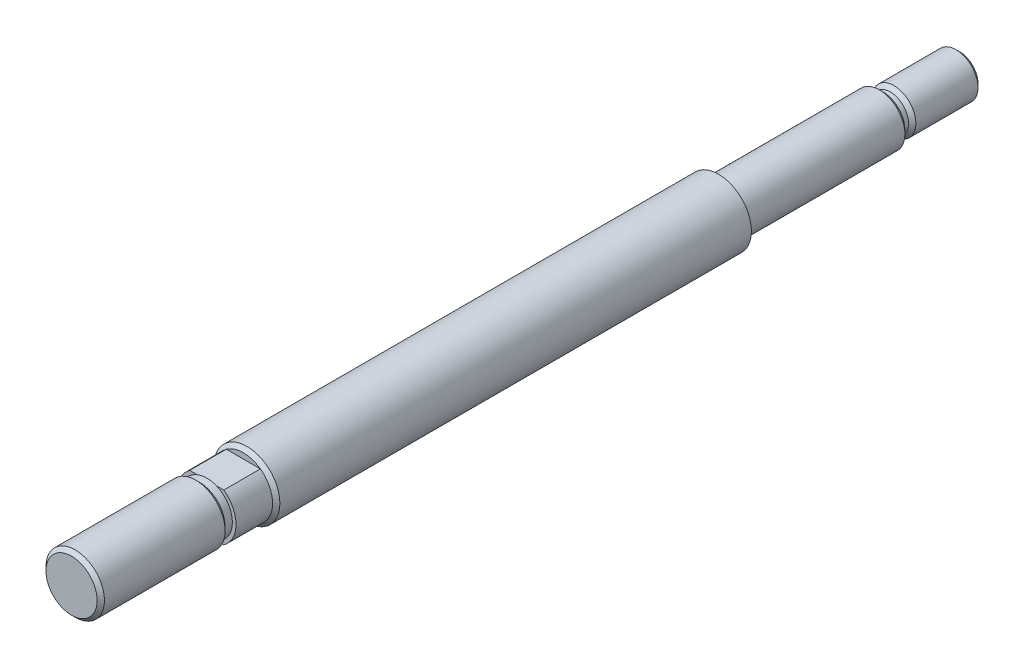
ISO-10303-21;
HEADER;
FILE_DESCRIPTION(('STEP AP214'),'2;1');
FILE_NAME('part.step','',(''),(''),'','','');
FILE_SCHEMA(('AUTOMOTIVE_DESIGN { 1 0 10303 214 1 1 1 1 }'));
ENDSEC;
DATA;
#1=APPLICATION_CONTEXT('core data for automotive mechanical design processes');
#2=APPLICATION_PROTOCOL_DEFINITION('international standard','automotive_design',2000,#1);
#3=PRODUCT_CONTEXT('',#1,'mechanical');
#4=PRODUCT('Part','Part','',(#3));
#5=PRODUCT_RELATED_PRODUCT_CATEGORY('part','',(#4));
#6=PRODUCT_DEFINITION_FORMATION('','',#4);
#7=PRODUCT_DEFINITION_CONTEXT('part definition',#1,'design');
#8=PRODUCT_DEFINITION('design','',#6,#7);
#9=PRODUCT_DEFINITION_SHAPE('','',#8);
#10=(LENGTH_UNIT() NAMED_UNIT(*) SI_UNIT(.MILLI.,.METRE.));
#11=(NAMED_UNIT(*) PLANE_ANGLE_UNIT() SI_UNIT($,.RADIAN.));
#12=(NAMED_UNIT(*) SI_UNIT($,.STERADIAN.) SOLID_ANGLE_UNIT());
#13=UNCERTAINTY_MEASURE_WITH_UNIT(LENGTH_MEASURE(1.E-05),#10,'distance_accuracy_value','');
#14=(GEOMETRIC_REPRESENTATION_CONTEXT(3) GLOBAL_UNCERTAINTY_ASSIGNED_CONTEXT((#13)) GLOBAL_UNIT_ASSIGNED_CONTEXT((#10,
#11,#12)) REPRESENTATION_CONTEXT('',''));
#15=CARTESIAN_POINT('',(0.,0.,0.));
#16=DIRECTION('',(0.,0.,1.));
#17=DIRECTION('',(1.,0.,0.));
#18=AXIS2_PLACEMENT_3D('',#15,#16,#17);
#19=CARTESIAN_POINT('',(0.,0.,84.5));
#20=DIRECTION('',(0.,0.,1.));
#21=DIRECTION('',(1.,0.,0.));
#22=AXIS2_PLACEMENT_3D('',#19,#20,#21);
#23=PLANE('',#22);
#24=DIRECTION('',(1.,0.,0.));
#25=VECTOR('',#24,1.);
#26=CARTESIAN_POINT('',(-17.5,-6.5,84.5));
#27=LINE('',#26,#25);
#28=CARTESIAN_POINT('',(2.59807621135341,-6.5,84.4999999999914));
#29=VERTEX_POINT('',#28);
#30=CARTESIAN_POINT('',(4.66368952654441,-6.5,84.5));
#31=VERTEX_POINT('',#30);
#32=EDGE_CURVE('E107',#29,#31,#27,.T.);
#33=ORIENTED_EDGE('',*,*,#32,.T.);
#34=CARTESIAN_POINT('',(0.,0.,84.5));
#35=DIRECTION('',(0.,0.,1.));
#36=DIRECTION('',(1.,0.,0.));
#37=AXIS2_PLACEMENT_3D('',#34,#35,#36);
#38=CIRCLE('',#37,8.);
#39=CARTESIAN_POINT('',(4.66368952654441,6.5,84.5));
#40=VERTEX_POINT('',#39);
#41=EDGE_CURVE('E125',#31,#40,#38,.T.);
#42=ORIENTED_EDGE('',*,*,#41,.T.);
#43=DIRECTION('',(1.,0.,0.));
#44=VECTOR('',#43,1.);
#45=CARTESIAN_POINT('',(-17.5,6.5,84.5));
#46=LINE('',#45,#44);
#47=CARTESIAN_POINT('',(2.59807621135341,6.5,84.4999999999914));
#48=VERTEX_POINT('',#47);
#49=EDGE_CURVE('E265',#48,#40,#46,.T.);
#50=ORIENTED_EDGE('',*,*,#49,.F.);
#51=CARTESIAN_POINT('',(0.,0.,84.4999999999914));
#52=DIRECTION('',(0.,0.,1.));
#53=DIRECTION('',(1.,0.,0.));
#54=AXIS2_PLACEMENT_3D('',#51,#52,#53);
#55=CIRCLE('',#54,7.00000000000003);
#56=EDGE_CURVE('E259',#29,#48,#55,.T.);
#57=ORIENTED_EDGE('',*,*,#56,.F.);
#58=EDGE_LOOP('',(#33,#42,#50,#57));
#59=FACE_BOUND('',#58,.T.);
#60=ADVANCED_FACE('F44',(#59),#23,.T.);
#61=CARTESIAN_POINT('',(0.,0.,84.5));
#62=DIRECTION('',(0.,0.,-1.));
#63=DIRECTION('',(-1.,0.,0.));
#64=AXIS2_PLACEMENT_3D('',#61,#62,#63);
#65=CYLINDRICAL_SURFACE('',#64,8.);
#66=CARTESIAN_POINT('',(0.,0.,74.5));
#67=DIRECTION('',(0.,0.,1.));
#68=DIRECTION('',(1.,0.,0.));
#69=AXIS2_PLACEMENT_3D('',#66,#67,#68);
#70=CIRCLE('',#69,8.);
#71=CARTESIAN_POINT('',(-4.66368952654447,6.5,74.5));
#72=VERTEX_POINT('',#71);
#73=CARTESIAN_POINT('',(-4.66368952654447,-6.5,74.5));
#74=VERTEX_POINT('',#73);
#75=EDGE_CURVE('E120',#72,#74,#70,.T.);
#76=ORIENTED_EDGE('',*,*,#75,.T.);
#77=DIRECTION('',(0.,0.,-1.));
#78=VECTOR('',#77,1.);
#79=CARTESIAN_POINT('',(-4.66368952654441,-6.5,84.5));
#80=LINE('',#79,#78);
#81=CARTESIAN_POINT('',(-4.66368952654441,-6.5,84.5));
#82=VERTEX_POINT('',#81);
#83=EDGE_CURVE('E105',#74,#82,#80,.F.);
#84=ORIENTED_EDGE('',*,*,#83,.T.);
#85=CARTESIAN_POINT('',(-4.66368952654441,6.5,84.5));
#86=VERTEX_POINT('',#85);
#87=EDGE_CURVE('E114',#86,#82,#38,.T.);
#88=ORIENTED_EDGE('',*,*,#87,.F.);
#89=DIRECTION('',(0.,0.,-1.));
#90=VECTOR('',#89,1.);
#91=CARTESIAN_POINT('',(-4.66368952654441,6.5,84.5));
#92=LINE('',#91,#90);
#93=EDGE_CURVE('E254',#86,#72,#92,.T.);
#94=ORIENTED_EDGE('',*,*,#93,.T.);
#95=EDGE_LOOP('',(#76,#84,#88,#94));
#96=FACE_BOUND('',#95,.T.);
#97=ADVANCED_FACE('F113',(#96),#65,.T.);
#98=CARTESIAN_POINT('',(-2.59807621135341,-6.5,84.4999999999914));
#99=VERTEX_POINT('',#98);
#100=EDGE_CURVE('E96',#82,#99,#27,.T.);
#101=ORIENTED_EDGE('',*,*,#100,.T.);
#102=CARTESIAN_POINT('',(-2.59807621135341,6.5,84.4999999999914));
#103=VERTEX_POINT('',#102);
#104=EDGE_CURVE('E274',#103,#99,#55,.T.);
#105=ORIENTED_EDGE('',*,*,#104,.F.);
#106=EDGE_CURVE('E70',#86,#103,#46,.T.);
#107=ORIENTED_EDGE('',*,*,#106,.F.);
#108=ORIENTED_EDGE('',*,*,#87,.T.);
#109=EDGE_LOOP('',(#101,#105,#107,#108));
#110=FACE_BOUND('',#109,.T.);
#111=ADVANCED_FACE('F119',(#110),#23,.T.);
#112=CARTESIAN_POINT('',(0.,0.,121.5));
#113=DIRECTION('',(0.,0.,-1.));
#114=DIRECTION('',(-1.,0.,0.));
#115=AXIS2_PLACEMENT_3D('',#112,#113,#114);
#116=CYLINDRICAL_SURFACE('',#115,9.);
#117=CARTESIAN_POINT('',(0.,0.,73.5));
#118=DIRECTION('',(0.,0.,1.));
#119=DIRECTION('',(1.,0.,0.));
#120=AXIS2_PLACEMENT_3D('',#117,#118,#119);
#121=CIRCLE('',#120,9.);
#122=CARTESIAN_POINT('',(9.,0.,73.5));
#123=VERTEX_POINT('',#122);
#124=EDGE_CURVE('E160',#123,#123,#121,.F.);
#125=ORIENTED_EDGE('',*,*,#124,.T.);
#126=EDGE_LOOP('',(#125));
#127=FACE_BOUND('',#126,.T.);
#128=CARTESIAN_POINT('',(0.,0.,-55.5));
#129=DIRECTION('',(0.,0.,-1.));
#130=DIRECTION('',(-1.,0.,0.));
#131=AXIS2_PLACEMENT_3D('',#128,#129,#130);
#132=CIRCLE('',#131,9.);
#133=CARTESIAN_POINT('',(-9.,0.,-55.5));
#134=VERTEX_POINT('',#133);
#135=EDGE_CURVE('E123',#134,#134,#132,.T.);
#136=ORIENTED_EDGE('',*,*,#135,.F.);
#137=EDGE_LOOP('',(#136));
#138=FACE_BOUND('',#137,.T.);
#139=ADVANCED_FACE('F210',(#127,#138),#116,.T.);
#140=CARTESIAN_POINT('',(0.,0.,-100.5));
#141=DIRECTION('',(0.,0.,-1.));
#142=DIRECTION('',(-1.,0.,0.));
#143=AXIS2_PLACEMENT_3D('',#140,#141,#142);
#144=PLANE('',#143);
#145=CARTESIAN_POINT('',(0.,0.,-100.5));
#146=DIRECTION('',(0.,0.,-1.));
#147=DIRECTION('',(-1.,0.,0.));
#148=AXIS2_PLACEMENT_3D('',#145,#146,#147);
#149=CIRCLE('',#148,6.00000000000012);
#150=CARTESIAN_POINT('',(-6.00000000000012,0.,-100.5));
#151=VERTEX_POINT('',#150);
#152=EDGE_CURVE('E139',#151,#151,#149,.T.);
#153=ORIENTED_EDGE('',*,*,#152,.T.);
#154=EDGE_LOOP('',(#153));
#155=FACE_BOUND('',#154,.T.);
#156=CARTESIAN_POINT('',(0.,0.,-100.5));
#157=DIRECTION('',(0.,0.,-1.));
#158=DIRECTION('',(-1.,0.,0.));
#159=AXIS2_PLACEMENT_3D('',#156,#157,#158);
#160=CIRCLE('',#159,5.);
#161=CARTESIAN_POINT('',(-5.,0.,-100.5));
#162=VERTEX_POINT('',#161);
#163=EDGE_CURVE('E134',#162,#162,#160,.T.);
#164=ORIENTED_EDGE('',*,*,#163,.F.);
#165=EDGE_LOOP('',(#164));
#166=FACE_BOUND('',#165,.T.);
#167=ADVANCED_FACE('F212',(#155,#166),#144,.T.);
#168=CARTESIAN_POINT('',(0.,0.,-100.5));
#169=DIRECTION('',(0.,0.,-1.));
#170=DIRECTION('',(-1.,0.,0.));
#171=AXIS2_PLACEMENT_3D('',#168,#169,#170);
#172=CYLINDRICAL_SURFACE('',#171,5.);
#173=ORIENTED_EDGE('',*,*,#163,.T.);
#174=EDGE_LOOP('',(#173));
#175=FACE_BOUND('',#174,.T.);
#176=CARTESIAN_POINT('',(0.,0.,-102.5));
#177=DIRECTION('',(0.,0.,-1.));
#178=DIRECTION('',(-1.,0.,0.));
#179=AXIS2_PLACEMENT_3D('',#176,#177,#178);
#180=CIRCLE('',#179,5.);
#181=CARTESIAN_POINT('',(-5.,0.,-102.5));
#182=VERTEX_POINT('',#181);
#183=EDGE_CURVE('E137',#182,#182,#180,.T.);
#184=ORIENTED_EDGE('',*,*,#183,.F.);
#185=EDGE_LOOP('',(#184));
#186=FACE_BOUND('',#185,.T.);
#187=ADVANCED_FACE('F220',(#175,#186),#172,.T.);
#188=CARTESIAN_POINT('',(0.,0.,-121.5));
#189=DIRECTION('',(0.,0.,1.));
#190=DIRECTION('',(1.,0.,0.));
#191=AXIS2_PLACEMENT_3D('',#188,#189,#190);
#192=PLANE('',#191);
#193=CARTESIAN_POINT('',(0.,0.,-121.5));
#194=DIRECTION('',(0.,0.,1.));
#195=DIRECTION('',(1.,0.,0.));
#196=AXIS2_PLACEMENT_3D('',#193,#194,#195);
#197=CIRCLE('',#196,5.);
#198=CARTESIAN_POINT('',(5.,0.,-121.5));
#199=VERTEX_POINT('',#198);
#200=EDGE_CURVE('E154',#199,#199,#197,.F.);
#201=ORIENTED_EDGE('',*,*,#200,.T.);
#202=EDGE_LOOP('',(#201));
#203=FACE_BOUND('',#202,.T.);
#204=ADVANCED_FACE('F225',(#203),#192,.F.);
#205=CARTESIAN_POINT('',(0.,0.,-102.5));
#206=DIRECTION('',(0.,0.,-1.));
#207=DIRECTION('',(-1.,0.,0.));
#208=AXIS2_PLACEMENT_3D('',#205,#206,#207);
#209=CYLINDRICAL_SURFACE('',#208,6.);
#210=CARTESIAN_POINT('',(0.,0.,-103.5));
#211=DIRECTION('',(0.,0.,-1.));
#212=DIRECTION('',(-1.,0.,0.));
#213=AXIS2_PLACEMENT_3D('',#210,#211,#212);
#214=CIRCLE('',#213,6.);
#215=CARTESIAN_POINT('',(-6.,0.,-103.5));
#216=VERTEX_POINT('',#215);
#217=EDGE_CURVE('E153',#216,#216,#214,.T.);
#218=ORIENTED_EDGE('',*,*,#217,.T.);
#219=EDGE_LOOP('',(#218));
#220=FACE_BOUND('',#219,.T.);
#221=CARTESIAN_POINT('',(0.,0.,-120.5));
#222=DIRECTION('',(0.,0.,1.));
#223=DIRECTION('',(1.,0.,0.));
#224=AXIS2_PLACEMENT_3D('',#221,#222,#223);
#225=CIRCLE('',#224,6.);
#226=CARTESIAN_POINT('',(6.,0.,-120.5));
#227=VERTEX_POINT('',#226);
#228=EDGE_CURVE('E149',#227,#227,#225,.T.);
#229=ORIENTED_EDGE('',*,*,#228,.T.);
#230=EDGE_LOOP('',(#229));
#231=FACE_BOUND('',#230,.T.);
#232=ADVANCED_FACE('F343',(#220,#231),#209,.T.);
#233=CARTESIAN_POINT('',(0.,0.,-55.5));
#234=DIRECTION('',(0.,0.,-1.));
#235=DIRECTION('',(-1.,0.,0.));
#236=AXIS2_PLACEMENT_3D('',#233,#234,#235);
#237=PLANE('',#236);
#238=CARTESIAN_POINT('',(0.,0.,-55.5));
#239=DIRECTION('',(0.,0.,-1.));
#240=DIRECTION('',(-1.,0.,0.));
#241=AXIS2_PLACEMENT_3D('',#238,#239,#240);
#242=CIRCLE('',#241,7.);
#243=CARTESIAN_POINT('',(-7.,0.,-55.5));
#244=VERTEX_POINT('',#243);
#245=EDGE_CURVE('E122',#244,#244,#242,.T.);
#246=ORIENTED_EDGE('',*,*,#245,.F.);
#247=EDGE_LOOP('',(#246));
#248=FACE_BOUND('',#247,.T.);
#249=ORIENTED_EDGE('',*,*,#135,.T.);
#250=EDGE_LOOP('',(#249));
#251=FACE_BOUND('',#250,.T.);
#252=ADVANCED_FACE('F349',(#248,#251),#237,.T.);
#253=CARTESIAN_POINT('',(0.,0.,-55.5));
#254=DIRECTION('',(0.,0.,-1.));
#255=DIRECTION('',(-1.,0.,0.));
#256=AXIS2_PLACEMENT_3D('',#253,#254,#255);
#257=CYLINDRICAL_SURFACE('',#256,7.);
#258=CARTESIAN_POINT('',(0.,0.,-99.5000000000001));
#259=DIRECTION('',(0.,0.,-1.));
#260=DIRECTION('',(-1.,0.,0.));
#261=AXIS2_PLACEMENT_3D('',#258,#259,#260);
#262=CIRCLE('',#261,7.);
#263=CARTESIAN_POINT('',(-7.,0.,-99.5000000000001));
#264=VERTEX_POINT('',#263);
#265=EDGE_CURVE('E143',#264,#264,#262,.F.);
#266=CARTESIAN_POINT('',(-7.,0.,-99.5000000000001));
#267=CARTESIAN_POINT('',(-7.,0.,-99.0416666666668));
#268=CARTESIAN_POINT('',(-7.,0.,-98.5833333333334));
#269=CARTESIAN_POINT('',(-7.,0.,-97.6666666666668));
#270=CARTESIAN_POINT('',(-7.,0.,-97.2083333333334));
#271=CARTESIAN_POINT('',(-7.,0.,-96.2916666666667));
#272=CARTESIAN_POINT('',(-7.,0.,-95.8333333333334));
#273=CARTESIAN_POINT('',(-7.,0.,-94.9166666666667));
#274=CARTESIAN_POINT('',(-7.,0.,-94.4583333333334));
#275=CARTESIAN_POINT('',(-7.,0.,-93.5416666666667));
#276=CARTESIAN_POINT('',(-7.,0.,-93.0833333333334));
#277=CARTESIAN_POINT('',(-7.,0.,-92.1666666666667));
#278=CARTESIAN_POINT('',(-7.,0.,-91.7083333333334));
#279=CARTESIAN_POINT('',(-7.,0.,-90.7916666666667));
#280=CARTESIAN_POINT('',(-7.,0.,-90.3333333333334));
#281=CARTESIAN_POINT('',(-7.,0.,-89.4166666666667));
#282=CARTESIAN_POINT('',(-7.,0.,-88.9583333333334));
#283=CARTESIAN_POINT('',(-7.,0.,-88.0416666666667));
#284=CARTESIAN_POINT('',(-7.,0.,-87.5833333333334));
#285=CARTESIAN_POINT('',(-7.,0.,-86.6666666666667));
#286=CARTESIAN_POINT('',(-7.,0.,-86.2083333333334));
#287=CARTESIAN_POINT('',(-7.,0.,-85.2916666666667));
#288=CARTESIAN_POINT('',(-7.,0.,-84.8333333333334));
#289=CARTESIAN_POINT('',(-7.,0.,-83.9166666666667));
#290=CARTESIAN_POINT('',(-7.,0.,-83.4583333333334));
#291=CARTESIAN_POINT('',(-7.,0.,-82.5416666666667));
#292=CARTESIAN_POINT('',(-7.,0.,-82.0833333333334));
#293=CARTESIAN_POINT('',(-7.,0.,-81.1666666666667));
#294=CARTESIAN_POINT('',(-7.,0.,-80.7083333333334));
#295=CARTESIAN_POINT('',(-7.,0.,-79.7916666666667));
#296=CARTESIAN_POINT('',(-7.,0.,-79.3333333333334));
#297=CARTESIAN_POINT('',(-7.,0.,-78.4166666666667));
#298=CARTESIAN_POINT('',(-7.,0.,-77.9583333333334));
#299=CARTESIAN_POINT('',(-7.,0.,-77.0416666666667));
#300=CARTESIAN_POINT('',(-7.,0.,-76.5833333333334));
#301=CARTESIAN_POINT('',(-7.,0.,-75.6666666666667));
#302=CARTESIAN_POINT('',(-7.,0.,-75.2083333333334));
#303=CARTESIAN_POINT('',(-7.,0.,-74.2916666666667));
#304=CARTESIAN_POINT('',(-7.,0.,-73.8333333333334));
#305=CARTESIAN_POINT('',(-7.,0.,-72.9166666666667));
#306=CARTESIAN_POINT('',(-7.,0.,-72.4583333333334));
#307=CARTESIAN_POINT('',(-7.,0.,-71.5416666666667));
#308=CARTESIAN_POINT('',(-7.,0.,-71.0833333333334));
#309=CARTESIAN_POINT('',(-7.,0.,-70.1666666666667));
#310=CARTESIAN_POINT('',(-7.,0.,-69.7083333333334));
#311=CARTESIAN_POINT('',(-7.,0.,-68.7916666666667));
#312=CARTESIAN_POINT('',(-7.,0.,-68.3333333333334));
#313=CARTESIAN_POINT('',(-7.,0.,-67.4166666666667));
#314=CARTESIAN_POINT('',(-7.,0.,-66.9583333333334));
#315=CARTESIAN_POINT('',(-7.,0.,-66.0416666666667));
#316=CARTESIAN_POINT('',(-7.,0.,-65.5833333333333));
#317=CARTESIAN_POINT('',(-7.,0.,-64.6666666666667));
#318=CARTESIAN_POINT('',(-7.,0.,-64.2083333333333));
#319=CARTESIAN_POINT('',(-7.,0.,-63.2916666666667));
#320=CARTESIAN_POINT('',(-7.,0.,-62.8333333333333));
#321=CARTESIAN_POINT('',(-7.,0.,-61.9166666666667));
#322=CARTESIAN_POINT('',(-7.,0.,-61.4583333333333));
#323=CARTESIAN_POINT('',(-7.,0.,-60.5416666666667));
#324=CARTESIAN_POINT('',(-7.,0.,-60.0833333333333));
#325=CARTESIAN_POINT('',(-7.,0.,-59.1666666666667));
#326=CARTESIAN_POINT('',(-7.,0.,-58.7083333333333));
#327=CARTESIAN_POINT('',(-7.,0.,-57.7916666666667));
#328=CARTESIAN_POINT('',(-7.,0.,-57.3333333333333));
#329=CARTESIAN_POINT('',(-7.,0.,-56.4166666666667));
#330=CARTESIAN_POINT('',(-7.,0.,-55.9583333333333));
#331=CARTESIAN_POINT('',(-7.,0.,-55.5));
#332=B_SPLINE_CURVE_WITH_KNOTS('',3,(#266,#267,#268,#269,#270,#271,#272,#273,#274,#275,#276,
#277,#278,#279,#280,#281,#282,#283,#284,#285,#286,#287,#288,#289,#290,#291,#292,#293,#294,#295,
#296,#297,#298,#299,#300,#301,#302,#303,#304,#305,#306,#307,#308,#309,#310,#311,#312,#313,#314,
#315,#316,#317,#318,#319,#320,#321,#322,#323,#324,#325,#326,#327,#328,#329,#330,#331),
.UNSPECIFIED.,.F.,.F.,(4,2,2,2,2,2,2,2,2,2,2,2,2,2,2,2,2,2,2,2,2,2,2,2,2,2,2,2,2,2,2,2,4),(0.,
1.37499999999999,2.75,4.125,5.50000000000001,6.87500000000002,8.25000000000001,9.62500000000002,
11.,12.375,13.75,15.125,16.5,17.875,19.25,20.625,22.,23.375,24.75,26.1250000000001,
27.5000000000001,28.8750000000001,30.2500000000001,31.6250000000001,33.0000000000001,
34.3750000000001,35.7500000000001,37.1250000000001,38.5000000000001,39.8750000000001,
41.2500000000001,42.6250000000001,44.0000000000001),.UNSPECIFIED.);
#333=EDGE_CURVE('BSEAM227',#264,#244,#332,.T.);
#334=ORIENTED_EDGE('',*,*,#265,.T.);
#335=ORIENTED_EDGE('',*,*,#245,.T.);
#336=ORIENTED_EDGE('',*,*,#333,.T.);
#337=ORIENTED_EDGE('',*,*,#333,.F.);
#338=EDGE_LOOP('',(#334,#336,#335,#337));
#339=FACE_BOUND('',#338,.T.);
#340=ADVANCED_FACE('F227',(#339),#257,.T.);
#341=CARTESIAN_POINT('',(0.,0.,-100.5));
#342=DIRECTION('',(0.,0.,1.));
#343=DIRECTION('',(1.,0.,0.));
#344=AXIS2_PLACEMENT_3D('',#341,#342,#343);
#345=CONICAL_SURFACE('',#344,6.00000000000012,0.785398163397446);
#346=ORIENTED_EDGE('',*,*,#265,.F.);
#347=EDGE_LOOP('',(#346));
#348=FACE_BOUND('',#347,.T.);
#349=ORIENTED_EDGE('',*,*,#152,.F.);
#350=EDGE_LOOP('',(#349));
#351=FACE_BOUND('',#350,.T.);
#352=ADVANCED_FACE('F222',(#348,#351),#345,.T.);
#353=CARTESIAN_POINT('',(0.,0.,-102.5));
#354=DIRECTION('',(0.,0.,-1.));
#355=DIRECTION('',(-1.,0.,0.));
#356=AXIS2_PLACEMENT_3D('',#353,#354,#355);
#357=CONICAL_SURFACE('',#356,5.,0.785398163397439);
#358=ORIENTED_EDGE('',*,*,#217,.F.);
#359=EDGE_LOOP('',(#358));
#360=FACE_BOUND('',#359,.T.);
#361=ORIENTED_EDGE('',*,*,#183,.T.);
#362=EDGE_LOOP('',(#361));
#363=FACE_BOUND('',#362,.T.);
#364=ADVANCED_FACE('F228',(#360,#363),#357,.T.);
#365=CARTESIAN_POINT('',(0.,0.,-121.5));
#366=DIRECTION('',(0.,0.,1.));
#367=DIRECTION('',(1.,0.,0.));
#368=AXIS2_PLACEMENT_3D('',#365,#366,#367);
#369=CONICAL_SURFACE('',#368,5.,0.785398163397439);
#370=ORIENTED_EDGE('',*,*,#228,.F.);
#371=EDGE_LOOP('',(#370));
#372=FACE_BOUND('',#371,.T.);
#373=ORIENTED_EDGE('',*,*,#200,.F.);
#374=EDGE_LOOP('',(#373));
#375=FACE_BOUND('',#374,.T.);
#376=ADVANCED_FACE('F233',(#372,#375),#369,.T.);
#377=ORIENTED_EDGE('',*,*,#41,.F.);
#378=DIRECTION('',(0.,0.,-1.));
#379=VECTOR('',#378,1.);
#380=CARTESIAN_POINT('',(4.66368952654441,-6.5,84.5));
#381=LINE('',#380,#379);
#382=CARTESIAN_POINT('',(4.66368952654447,-6.5,74.5));
#383=VERTEX_POINT('',#382);
#384=EDGE_CURVE('E117',#31,#383,#381,.T.);
#385=ORIENTED_EDGE('',*,*,#384,.T.);
#386=CARTESIAN_POINT('',(4.66368952654447,6.5,74.5));
#387=VERTEX_POINT('',#386);
#388=EDGE_CURVE('E135',#383,#387,#70,.T.);
#389=ORIENTED_EDGE('',*,*,#388,.T.);
#390=DIRECTION('',(0.,0.,-1.));
#391=VECTOR('',#390,1.);
#392=CARTESIAN_POINT('',(4.66368952654441,6.5,84.5));
#393=LINE('',#392,#391);
#394=EDGE_CURVE('E257',#387,#40,#393,.F.);
#395=ORIENTED_EDGE('',*,*,#394,.T.);
#396=EDGE_LOOP('',(#377,#385,#389,#395));
#397=FACE_BOUND('',#396,.T.);
#398=ADVANCED_FACE('F205',(#397),#65,.T.);
#399=CARTESIAN_POINT('',(0.,0.,74.5));
#400=DIRECTION('',(0.,0.,-1.));
#401=DIRECTION('',(-1.,0.,0.));
#402=AXIS2_PLACEMENT_3D('',#399,#400,#401);
#403=CONICAL_SURFACE('',#402,8.00000000000004,0.785398163397436);
#404=ORIENTED_EDGE('',*,*,#124,.F.);
#405=EDGE_LOOP('',(#404));
#406=FACE_BOUND('',#405,.T.);
#407=EDGE_CURVE('E130',#387,#72,#70,.T.);
#408=ORIENTED_EDGE('',*,*,#407,.F.);
#409=ORIENTED_EDGE('',*,*,#388,.F.);
#410=EDGE_CURVE('E275',#74,#383,#70,.T.);
#411=ORIENTED_EDGE('',*,*,#410,.F.);
#412=ORIENTED_EDGE('',*,*,#75,.F.);
#413=EDGE_LOOP('',(#408,#409,#411,#412));
#414=FACE_BOUND('',#413,.T.);
#415=ADVANCED_FACE('F195',(#406,#414),#403,.T.);
#416=CARTESIAN_POINT('',(0.,0.,-500000.));
#417=DIRECTION('',(0.,0.,1.));
#418=DIRECTION('',(1.,0.,0.));
#419=AXIS2_PLACEMENT_3D('',#416,#417,#418);
#420=CYLINDRICAL_SURFACE('',#419,7.00000000000003);
#421=EDGE_CURVE('E128',#48,#103,#55,.T.);
#422=ORIENTED_EDGE('',*,*,#421,.T.);
#423=ORIENTED_EDGE('',*,*,#104,.T.);
#424=EDGE_CURVE('E256',#99,#29,#55,.T.);
#425=ORIENTED_EDGE('',*,*,#424,.T.);
#426=ORIENTED_EDGE('',*,*,#56,.T.);
#427=EDGE_LOOP('',(#422,#423,#425,#426));
#428=FACE_BOUND('',#427,.T.);
#429=CARTESIAN_POINT('',(0.,0.,86.5));
#430=DIRECTION('',(0.,0.,1.));
#431=DIRECTION('',(1.,0.,0.));
#432=AXIS2_PLACEMENT_3D('',#429,#430,#431);
#433=CIRCLE('',#432,7.00000000000003);
#434=CARTESIAN_POINT('',(7.00000000000003,0.,86.5));
#435=VERTEX_POINT('',#434);
#436=EDGE_CURVE('E52',#435,#435,#433,.F.);
#437=ORIENTED_EDGE('',*,*,#436,.T.);
#438=EDGE_LOOP('',(#437));
#439=FACE_BOUND('',#438,.T.);
#440=ADVANCED_FACE('F166',(#428,#439),#420,.T.);
#441=CARTESIAN_POINT('',(0.,0.,121.5));
#442=DIRECTION('',(0.,0.,1.));
#443=DIRECTION('',(1.,0.,0.));
#444=AXIS2_PLACEMENT_3D('',#441,#442,#443);
#445=PLANE('',#444);
#446=CARTESIAN_POINT('',(0.,0.,121.5));
#447=DIRECTION('',(0.,0.,1.));
#448=DIRECTION('',(1.,0.,0.));
#449=AXIS2_PLACEMENT_3D('',#446,#447,#448);
#450=CIRCLE('',#449,7.00000000000001);
#451=CARTESIAN_POINT('',(7.00000000000001,0.,121.5));
#452=VERTEX_POINT('',#451);
#453=EDGE_CURVE('E12',#452,#452,#450,.T.);
#454=ORIENTED_EDGE('',*,*,#453,.T.);
#455=EDGE_LOOP('',(#454));
#456=FACE_BOUND('',#455,.T.);
#457=ADVANCED_FACE('F183',(#456),#445,.T.);
#458=CARTESIAN_POINT('',(0.,0.,121.5));
#459=DIRECTION('',(0.,0.,-1.));
#460=DIRECTION('',(-1.,0.,0.));
#461=AXIS2_PLACEMENT_3D('',#458,#459,#460);
#462=CONICAL_SURFACE('',#461,7.00000000000001,0.785398163397431);
#463=CARTESIAN_POINT('',(0.,0.,120.5));
#464=DIRECTION('',(0.,0.,1.));
#465=DIRECTION('',(1.,0.,0.));
#466=AXIS2_PLACEMENT_3D('',#463,#464,#465);
#467=CIRCLE('',#466,8.);
#468=CARTESIAN_POINT('',(8.,0.,120.5));
#469=VERTEX_POINT('',#468);
#470=EDGE_CURVE('E159',#469,#469,#467,.F.);
#471=ORIENTED_EDGE('',*,*,#470,.F.);
#472=EDGE_LOOP('',(#471));
#473=FACE_BOUND('',#472,.T.);
#474=ORIENTED_EDGE('',*,*,#453,.F.);
#475=EDGE_LOOP('',(#474));
#476=FACE_BOUND('',#475,.T.);
#477=ADVANCED_FACE('F50',(#473,#476),#462,.T.);
#478=CARTESIAN_POINT('',(0.,0.,86.5));
#479=DIRECTION('',(0.,0.,1.));
#480=DIRECTION('',(1.,0.,0.));
#481=AXIS2_PLACEMENT_3D('',#478,#479,#480);
#482=CYLINDRICAL_SURFACE('',#481,8.);
#483=CARTESIAN_POINT('',(0.,0.,87.5));
#484=DIRECTION('',(0.,0.,1.));
#485=DIRECTION('',(1.,0.,0.));
#486=AXIS2_PLACEMENT_3D('',#483,#484,#485);
#487=CIRCLE('',#486,8.);
#488=CARTESIAN_POINT('',(8.,0.,87.5));
#489=VERTEX_POINT('',#488);
#490=EDGE_CURVE('E161',#489,#489,#487,.T.);
#491=ORIENTED_EDGE('',*,*,#490,.T.);
#492=EDGE_LOOP('',(#491));
#493=FACE_BOUND('',#492,.T.);
#494=ORIENTED_EDGE('',*,*,#470,.T.);
#495=EDGE_LOOP('',(#494));
#496=FACE_BOUND('',#495,.T.);
#497=ADVANCED_FACE('F172',(#493,#496),#482,.T.);
#498=CARTESIAN_POINT('',(0.,0.,87.5));
#499=DIRECTION('',(0.,0.,1.));
#500=DIRECTION('',(1.,0.,0.));
#501=AXIS2_PLACEMENT_3D('',#498,#499,#500);
#502=CONICAL_SURFACE('',#501,8.,0.785398163397431);
#503=ORIENTED_EDGE('',*,*,#436,.F.);
#504=EDGE_LOOP('',(#503));
#505=FACE_BOUND('',#504,.T.);
#506=ORIENTED_EDGE('',*,*,#490,.F.);
#507=EDGE_LOOP('',(#506));
#508=FACE_BOUND('',#507,.T.);
#509=ADVANCED_FACE('F167',(#505,#508),#502,.T.);
#510=CARTESIAN_POINT('',(-17.5,6.5,84.5));
#511=DIRECTION('',(0.,-1.,0.));
#512=DIRECTION('',(0.,0.,-1.));
#513=AXIS2_PLACEMENT_3D('',#510,#511,#512);
#514=PLANE('',#513);
#515=ORIENTED_EDGE('',*,*,#106,.T.);
#516=EDGE_CURVE('E261',#103,#48,#46,.T.);
#517=ORIENTED_EDGE('',*,*,#516,.T.);
#518=ORIENTED_EDGE('',*,*,#49,.T.);
#519=ORIENTED_EDGE('',*,*,#394,.F.);
#520=DIRECTION('',(1.,0.,0.));
#521=VECTOR('',#520,1.);
#522=CARTESIAN_POINT('',(-17.5,6.5,74.5));
#523=LINE('',#522,#521);
#524=EDGE_CURVE('E252',#72,#387,#523,.T.);
#525=ORIENTED_EDGE('',*,*,#524,.F.);
#526=ORIENTED_EDGE('',*,*,#93,.F.);
#527=EDGE_LOOP('',(#515,#517,#518,#519,#525,#526));
#528=FACE_BOUND('',#527,.T.);
#529=ADVANCED_FACE('F173',(#528),#514,.F.);
#530=CARTESIAN_POINT('',(-17.5,6.5,84.5));
#531=DIRECTION('',(0.,0.,1.));
#532=DIRECTION('',(1.,0.,0.));
#533=AXIS2_PLACEMENT_3D('',#530,#531,#532);
#534=PLANE('',#533);
#535=ORIENTED_EDGE('',*,*,#516,.F.);
#536=ORIENTED_EDGE('',*,*,#421,.F.);
#537=EDGE_LOOP('',(#535,#536));
#538=FACE_BOUND('',#537,.T.);
#539=ADVANCED_FACE('F289',(#538),#534,.F.);
#540=CARTESIAN_POINT('',(-17.5,8.00000000000004,74.5));
#541=DIRECTION('',(0.,0.,-1.));
#542=DIRECTION('',(-1.,0.,0.));
#543=AXIS2_PLACEMENT_3D('',#540,#541,#542);
#544=PLANE('',#543);
#545=ORIENTED_EDGE('',*,*,#407,.T.);
#546=ORIENTED_EDGE('',*,*,#524,.T.);
#547=EDGE_LOOP('',(#545,#546));
#548=FACE_BOUND('',#547,.T.);
#549=ADVANCED_FACE('F249',(#548),#544,.F.);
#550=CARTESIAN_POINT('',(-17.5,-6.5,84.5));
#551=DIRECTION('',(0.,1.,0.));
#552=DIRECTION('',(0.,0.,1.));
#553=AXIS2_PLACEMENT_3D('',#550,#551,#552);
#554=PLANE('',#553);
#555=ORIENTED_EDGE('',*,*,#32,.F.);
#556=EDGE_CURVE('E56',#99,#29,#27,.T.);
#557=ORIENTED_EDGE('',*,*,#556,.F.);
#558=ORIENTED_EDGE('',*,*,#100,.F.);
#559=ORIENTED_EDGE('',*,*,#83,.F.);
#560=DIRECTION('',(1.,0.,0.));
#561=VECTOR('',#560,1.);
#562=CARTESIAN_POINT('',(-17.5,-6.5,74.5));
#563=LINE('',#562,#561);
#564=EDGE_CURVE('E269',#74,#383,#563,.T.);
#565=ORIENTED_EDGE('',*,*,#564,.T.);
#566=ORIENTED_EDGE('',*,*,#384,.F.);
#567=EDGE_LOOP('',(#555,#557,#558,#559,#565,#566));
#568=FACE_BOUND('',#567,.T.);
#569=ADVANCED_FACE('F99',(#568),#554,.F.);
#570=CARTESIAN_POINT('',(-17.5,-6.5,84.5));
#571=DIRECTION('',(0.,0.,1.));
#572=DIRECTION('',(1.,0.,0.));
#573=AXIS2_PLACEMENT_3D('',#570,#571,#572);
#574=PLANE('',#573);
#575=ORIENTED_EDGE('',*,*,#556,.T.);
#576=ORIENTED_EDGE('',*,*,#424,.F.);
#577=EDGE_LOOP('',(#575,#576));
#578=FACE_BOUND('',#577,.T.);
#579=ADVANCED_FACE('F277',(#578),#574,.F.);
#580=CARTESIAN_POINT('',(-17.5,-8.00000000000004,74.5));
#581=DIRECTION('',(0.,0.,-1.));
#582=DIRECTION('',(-1.,0.,0.));
#583=AXIS2_PLACEMENT_3D('',#580,#581,#582);
#584=PLANE('',#583);
#585=ORIENTED_EDGE('',*,*,#410,.T.);
#586=ORIENTED_EDGE('',*,*,#564,.F.);
#587=EDGE_LOOP('',(#585,#586));
#588=FACE_BOUND('',#587,.T.);
#589=ADVANCED_FACE('F279',(#588),#584,.F.);
#590=CLOSED_SHELL('',(#60,#97,#111,#139,#167,#187,#204,#232,#252,#340,#352,#364,#376,#398,#415,
#440,#457,#477,#497,#509,#529,#539,#549,#569,#579,#589));
#591=MANIFOLD_SOLID_BREP('B2',#590);
#592=ADVANCED_BREP_SHAPE_REPRESENTATION('',(#18,#591),#14);
#593=SHAPE_DEFINITION_REPRESENTATION(#9,#592);
ENDSEC;
END-ISO-10303-21;
